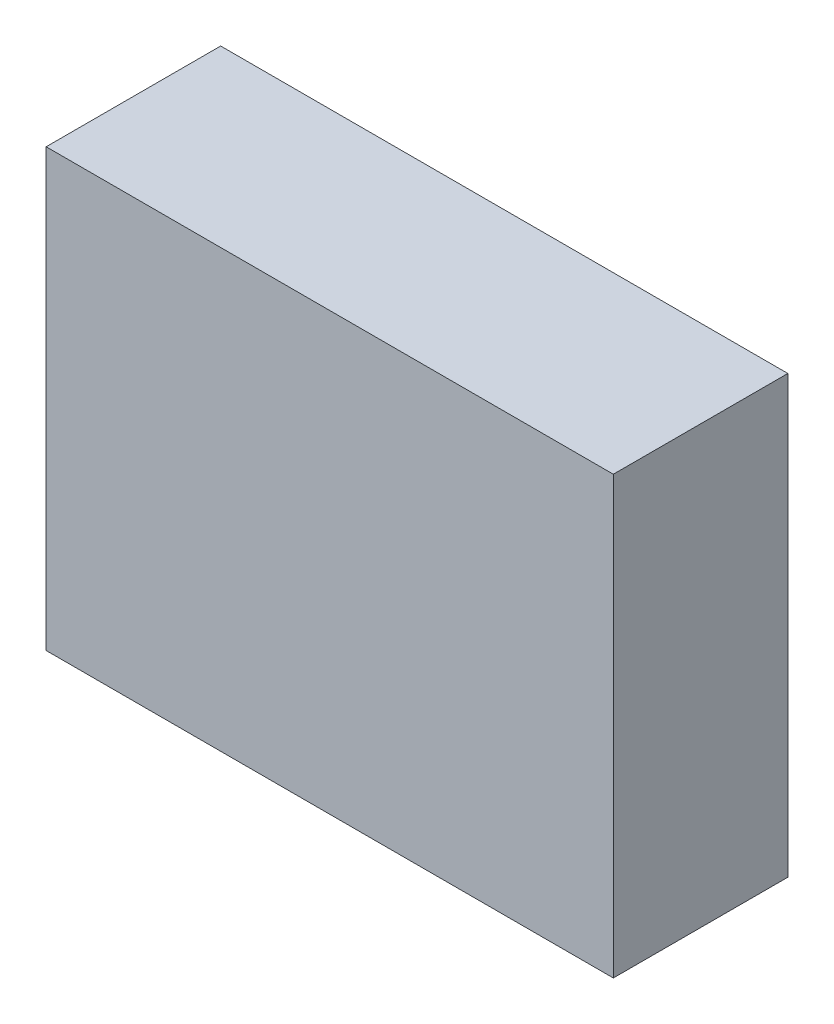
ISO-10303-21;
HEADER;
FILE_DESCRIPTION(('STEP AP214'),'2;1');
FILE_NAME('part.step','',(''),(''),'','','');
FILE_SCHEMA(('AUTOMOTIVE_DESIGN { 1 0 10303 214 1 1 1 1 }'));
ENDSEC;
DATA;
#1=APPLICATION_CONTEXT('core data for automotive mechanical design processes');
#2=APPLICATION_PROTOCOL_DEFINITION('international standard','automotive_design',2000,#1);
#3=PRODUCT_CONTEXT('',#1,'mechanical');
#4=PRODUCT('Part','Part','',(#3));
#5=PRODUCT_RELATED_PRODUCT_CATEGORY('part','',(#4));
#6=PRODUCT_DEFINITION_FORMATION('','',#4);
#7=PRODUCT_DEFINITION_CONTEXT('part definition',#1,'design');
#8=PRODUCT_DEFINITION('design','',#6,#7);
#9=PRODUCT_DEFINITION_SHAPE('','',#8);
#10=(LENGTH_UNIT() NAMED_UNIT(*) SI_UNIT(.MILLI.,.METRE.));
#11=(NAMED_UNIT(*) PLANE_ANGLE_UNIT() SI_UNIT($,.RADIAN.));
#12=(NAMED_UNIT(*) SI_UNIT($,.STERADIAN.) SOLID_ANGLE_UNIT());
#13=UNCERTAINTY_MEASURE_WITH_UNIT(LENGTH_MEASURE(1.E-05),#10,'distance_accuracy_value','');
#14=(GEOMETRIC_REPRESENTATION_CONTEXT(3) GLOBAL_UNCERTAINTY_ASSIGNED_CONTEXT((#13)) GLOBAL_UNIT_ASSIGNED_CONTEXT((#10,
#11,#12)) REPRESENTATION_CONTEXT('',''));
#15=CARTESIAN_POINT('',(0.,0.,0.));
#16=DIRECTION('',(0.,0.,1.));
#17=DIRECTION('',(1.,0.,0.));
#18=AXIS2_PLACEMENT_3D('',#15,#16,#17);
#19=CARTESIAN_POINT('',(-65.,100.,-15.6514657980456));
#20=DIRECTION('',(1.,0.,0.));
#21=DIRECTION('',(0.,0.,-1.));
#22=AXIS2_PLACEMENT_3D('',#19,#20,#21);
#23=PLANE('',#22);
#24=DIRECTION('',(0.,0.,1.));
#25=VECTOR('',#24,1.);
#26=CARTESIAN_POINT('',(-65.,0.,-15.6514657980456));
#27=LINE('',#26,#25);
#28=CARTESIAN_POINT('',(-65.,0.,-15.6514657980456));
#29=VERTEX_POINT('',#28);
#30=CARTESIAN_POINT('',(-65.,0.,24.3485342019544));
#31=VERTEX_POINT('',#30);
#32=EDGE_CURVE('E96',#29,#31,#27,.T.);
#33=ORIENTED_EDGE('',*,*,#32,.T.);
#34=DIRECTION('',(0.,-1.,0.));
#35=VECTOR('',#34,1.);
#36=CARTESIAN_POINT('',(-65.,100.,24.3485342019544));
#37=LINE('',#36,#35);
#38=CARTESIAN_POINT('',(-65.,100.,24.3485342019544));
#39=VERTEX_POINT('',#38);
#40=EDGE_CURVE('E11',#39,#31,#37,.T.);
#41=ORIENTED_EDGE('',*,*,#40,.F.);
#42=DIRECTION('',(0.,0.,1.));
#43=VECTOR('',#42,1.);
#44=CARTESIAN_POINT('',(-65.,100.,-15.6514657980456));
#45=LINE('',#44,#43);
#46=CARTESIAN_POINT('',(-65.,100.,-15.6514657980456));
#47=VERTEX_POINT('',#46);
#48=EDGE_CURVE('E84',#47,#39,#45,.T.);
#49=ORIENTED_EDGE('',*,*,#48,.F.);
#50=DIRECTION('',(0.,-1.,0.));
#51=VECTOR('',#50,1.);
#52=CARTESIAN_POINT('',(-65.,100.,-15.6514657980456));
#53=LINE('',#52,#51);
#54=EDGE_CURVE('E92',#47,#29,#53,.T.);
#55=ORIENTED_EDGE('',*,*,#54,.T.);
#56=EDGE_LOOP('',(#33,#41,#49,#55));
#57=FACE_BOUND('',#56,.T.);
#58=ADVANCED_FACE('F33',(#57),#23,.F.);
#59=CARTESIAN_POINT('',(-65.,100.,24.3485342019544));
#60=DIRECTION('',(0.,0.,-1.));
#61=DIRECTION('',(-1.,0.,0.));
#62=AXIS2_PLACEMENT_3D('',#59,#60,#61);
#63=PLANE('',#62);
#64=DIRECTION('',(1.,0.,0.));
#65=VECTOR('',#64,1.);
#66=CARTESIAN_POINT('',(-65.,0.,24.3485342019544));
#67=LINE('',#66,#65);
#68=CARTESIAN_POINT('',(65.,0.,24.3485342019544));
#69=VERTEX_POINT('',#68);
#70=EDGE_CURVE('E88',#31,#69,#67,.T.);
#71=ORIENTED_EDGE('',*,*,#70,.T.);
#72=DIRECTION('',(0.,-1.,0.));
#73=VECTOR('',#72,1.);
#74=CARTESIAN_POINT('',(65.,100.,24.3485342019544));
#75=LINE('',#74,#73);
#76=CARTESIAN_POINT('',(65.,100.,24.3485342019544));
#77=VERTEX_POINT('',#76);
#78=EDGE_CURVE('E41',#77,#69,#75,.T.);
#79=ORIENTED_EDGE('',*,*,#78,.F.);
#80=DIRECTION('',(1.,0.,0.));
#81=VECTOR('',#80,1.);
#82=CARTESIAN_POINT('',(-65.,100.,24.3485342019544));
#83=LINE('',#82,#81);
#84=EDGE_CURVE('E79',#39,#77,#83,.T.);
#85=ORIENTED_EDGE('',*,*,#84,.F.);
#86=ORIENTED_EDGE('',*,*,#40,.T.);
#87=EDGE_LOOP('',(#71,#79,#85,#86));
#88=FACE_BOUND('',#87,.T.);
#89=ADVANCED_FACE('F87',(#88),#63,.F.);
#90=CARTESIAN_POINT('',(65.,100.,-15.6514657980456));
#91=DIRECTION('',(-1.,0.,0.));
#92=DIRECTION('',(0.,0.,1.));
#93=AXIS2_PLACEMENT_3D('',#90,#91,#92);
#94=PLANE('',#93);
#95=DIRECTION('',(0.,0.,-1.));
#96=VECTOR('',#95,1.);
#97=CARTESIAN_POINT('',(65.,0.,-15.6514657980456));
#98=LINE('',#97,#96);
#99=CARTESIAN_POINT('',(65.,0.,-15.6514657980456));
#100=VERTEX_POINT('',#99);
#101=EDGE_CURVE('E66',#69,#100,#98,.T.);
#102=ORIENTED_EDGE('',*,*,#101,.T.);
#103=DIRECTION('',(0.,-1.,0.));
#104=VECTOR('',#103,1.);
#105=CARTESIAN_POINT('',(65.,100.,-15.6514657980456));
#106=LINE('',#105,#104);
#107=CARTESIAN_POINT('',(65.,100.,-15.6514657980456));
#108=VERTEX_POINT('',#107);
#109=EDGE_CURVE('E89',#108,#100,#106,.T.);
#110=ORIENTED_EDGE('',*,*,#109,.F.);
#111=DIRECTION('',(0.,0.,-1.));
#112=VECTOR('',#111,1.);
#113=CARTESIAN_POINT('',(65.,100.,-15.6514657980456));
#114=LINE('',#113,#112);
#115=EDGE_CURVE('E82',#77,#108,#114,.T.);
#116=ORIENTED_EDGE('',*,*,#115,.F.);
#117=ORIENTED_EDGE('',*,*,#78,.T.);
#118=EDGE_LOOP('',(#102,#110,#116,#117));
#119=FACE_BOUND('',#118,.T.);
#120=ADVANCED_FACE('F90',(#119),#94,.F.);
#121=CARTESIAN_POINT('',(-65.,100.,-15.6514657980456));
#122=DIRECTION('',(0.,0.,1.));
#123=DIRECTION('',(1.,0.,0.));
#124=AXIS2_PLACEMENT_3D('',#121,#122,#123);
#125=PLANE('',#124);
#126=DIRECTION('',(-1.,0.,0.));
#127=VECTOR('',#126,1.);
#128=CARTESIAN_POINT('',(-65.,0.,-15.6514657980456));
#129=LINE('',#128,#127);
#130=EDGE_CURVE('E72',#100,#29,#129,.T.);
#131=ORIENTED_EDGE('',*,*,#130,.T.);
#132=ORIENTED_EDGE('',*,*,#54,.F.);
#133=DIRECTION('',(-1.,0.,0.));
#134=VECTOR('',#133,1.);
#135=CARTESIAN_POINT('',(-65.,100.,-15.6514657980456));
#136=LINE('',#135,#134);
#137=EDGE_CURVE('E49',#108,#47,#136,.T.);
#138=ORIENTED_EDGE('',*,*,#137,.F.);
#139=ORIENTED_EDGE('',*,*,#109,.T.);
#140=EDGE_LOOP('',(#131,#132,#138,#139));
#141=FACE_BOUND('',#140,.T.);
#142=ADVANCED_FACE('F103',(#141),#125,.F.);
#143=CARTESIAN_POINT('',(0.,100.,0.));
#144=DIRECTION('',(0.,1.,0.));
#145=DIRECTION('',(0.,0.,1.));
#146=AXIS2_PLACEMENT_3D('',#143,#144,#145);
#147=PLANE('',#146);
#148=ORIENTED_EDGE('',*,*,#48,.T.);
#149=ORIENTED_EDGE('',*,*,#84,.T.);
#150=ORIENTED_EDGE('',*,*,#115,.T.);
#151=ORIENTED_EDGE('',*,*,#137,.T.);
#152=EDGE_LOOP('',(#148,#149,#150,#151));
#153=FACE_BOUND('',#152,.T.);
#154=ADVANCED_FACE('F80',(#153),#147,.T.);
#155=CARTESIAN_POINT('',(0.,0.,0.));
#156=DIRECTION('',(0.,1.,0.));
#157=DIRECTION('',(0.,0.,1.));
#158=AXIS2_PLACEMENT_3D('',#155,#156,#157);
#159=PLANE('',#158);
#160=ORIENTED_EDGE('',*,*,#32,.F.);
#161=ORIENTED_EDGE('',*,*,#130,.F.);
#162=ORIENTED_EDGE('',*,*,#101,.F.);
#163=ORIENTED_EDGE('',*,*,#70,.F.);
#164=EDGE_LOOP('',(#160,#161,#162,#163));
#165=FACE_BOUND('',#164,.T.);
#166=ADVANCED_FACE('F106',(#165),#159,.F.);
#167=CLOSED_SHELL('',(#58,#89,#120,#142,#154,#166));
#168=MANIFOLD_SOLID_BREP('B2',#167);
#169=ADVANCED_BREP_SHAPE_REPRESENTATION('',(#18,#168),#14);
#170=SHAPE_DEFINITION_REPRESENTATION(#9,#169);
ENDSEC;
END-ISO-10303-21;
